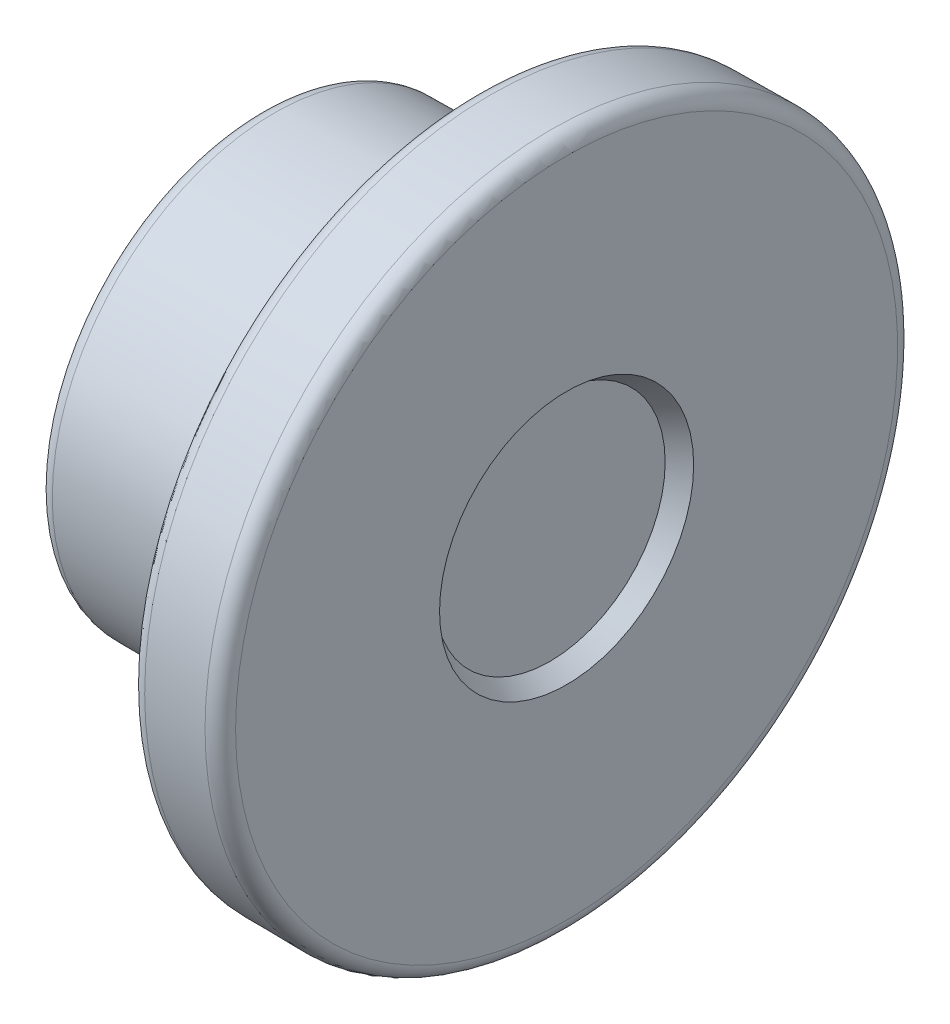
ISO-10303-21;
HEADER;
FILE_DESCRIPTION(('STEP AP214'),'2;1');
FILE_NAME('part.step','',(''),(''),'','','');
FILE_SCHEMA(('AUTOMOTIVE_DESIGN { 1 0 10303 214 1 1 1 1 }'));
ENDSEC;
DATA;
#1=APPLICATION_CONTEXT('core data for automotive mechanical design processes');
#2=APPLICATION_PROTOCOL_DEFINITION('international standard','automotive_design',2000,#1);
#3=PRODUCT_CONTEXT('',#1,'mechanical');
#4=PRODUCT('Part','Part','',(#3));
#5=PRODUCT_RELATED_PRODUCT_CATEGORY('part','',(#4));
#6=PRODUCT_DEFINITION_FORMATION('','',#4);
#7=PRODUCT_DEFINITION_CONTEXT('part definition',#1,'design');
#8=PRODUCT_DEFINITION('design','',#6,#7);
#9=PRODUCT_DEFINITION_SHAPE('','',#8);
#10=(LENGTH_UNIT() NAMED_UNIT(*) SI_UNIT(.MILLI.,.METRE.));
#11=(NAMED_UNIT(*) PLANE_ANGLE_UNIT() SI_UNIT($,.RADIAN.));
#12=(NAMED_UNIT(*) SI_UNIT($,.STERADIAN.) SOLID_ANGLE_UNIT());
#13=UNCERTAINTY_MEASURE_WITH_UNIT(LENGTH_MEASURE(1.E-05),#10,'distance_accuracy_value','');
#14=(GEOMETRIC_REPRESENTATION_CONTEXT(3) GLOBAL_UNCERTAINTY_ASSIGNED_CONTEXT((#13)) GLOBAL_UNIT_ASSIGNED_CONTEXT((#10,
#11,#12)) REPRESENTATION_CONTEXT('',''));
#15=CARTESIAN_POINT('',(0.,0.,0.));
#16=DIRECTION('',(0.,0.,1.));
#17=DIRECTION('',(1.,0.,0.));
#18=AXIS2_PLACEMENT_3D('',#15,#16,#17);
#19=CARTESIAN_POINT('',(10.3187457474607,25.8680369153271,42.0160979008728));
#20=DIRECTION('',(1.,0.,0.));
#21=DIRECTION('',(0.,0.,1.));
#22=AXIS2_PLACEMENT_3D('',#19,#20,#21);
#23=CONICAL_SURFACE('',#22,3.65000000000005,0.00872664625997167);
#24=CARTESIAN_POINT('',(10.2665641135861,25.8680369153271,42.0160979008728));
#25=DIRECTION('',(-1.,0.,0.));
#26=DIRECTION('',(0.,0.,1.));
#27=AXIS2_PLACEMENT_3D('',#24,#25,#26);
#28=CIRCLE('',#27,3.64954461778012);
#29=CARTESIAN_POINT('',(10.2665641135861,25.8680369153271,45.6656425186529));
#30=VERTEX_POINT('',#29);
#31=EDGE_CURVE('E53',#30,#30,#28,.F.);
#32=ORIENTED_EDGE('',*,*,#31,.T.);
#33=EDGE_LOOP('',(#32));
#34=FACE_BOUND('',#33,.T.);
#35=CARTESIAN_POINT('',(13.3209273813353,25.8680369153271,42.0160979008728));
#36=DIRECTION('',(-1.,0.,0.));
#37=DIRECTION('',(0.,0.,1.));
#38=AXIS2_PLACEMENT_3D('',#35,#36,#37);
#39=CIRCLE('',#38,3.67619964220272);
#40=CARTESIAN_POINT('',(13.3209273813353,25.8680369153271,45.6922975430755));
#41=VERTEX_POINT('',#40);
#42=EDGE_CURVE('E57',#41,#41,#39,.T.);
#43=ORIENTED_EDGE('',*,*,#42,.T.);
#44=EDGE_LOOP('',(#43));
#45=FACE_BOUND('',#44,.T.);
#46=ADVANCED_FACE('F42',(#34,#45),#23,.T.);
#47=CARTESIAN_POINT('',(10.0187457474607,25.8680369153271,42.0160979008728));
#48=DIRECTION('',(-1.,0.,0.));
#49=DIRECTION('',(0.,0.,1.));
#50=AXIS2_PLACEMENT_3D('',#47,#48,#49);
#51=PLANE('',#50);
#52=CARTESIAN_POINT('',(10.0187457474607,25.8680369153271,42.0160979008728));
#53=DIRECTION('',(-1.,0.,0.));
#54=DIRECTION('',(0.,0.,1.));
#55=AXIS2_PLACEMENT_3D('',#52,#53,#54);
#56=CIRCLE('',#55,3.39955413701408);
#57=CARTESIAN_POINT('',(10.0187457474607,25.8680369153271,45.4156520378869));
#58=VERTEX_POINT('',#57);
#59=EDGE_CURVE('E62',#58,#58,#56,.T.);
#60=ORIENTED_EDGE('',*,*,#59,.T.);
#61=EDGE_LOOP('',(#60));
#62=FACE_BOUND('',#61,.T.);
#63=ADVANCED_FACE('F100',(#62),#51,.T.);
#64=CARTESIAN_POINT('',(15.8187457474607,25.8680369153271,42.0160979008728));
#65=DIRECTION('',(1.,0.,0.));
#66=DIRECTION('',(0.,0.,-1.));
#67=AXIS2_PLACEMENT_3D('',#64,#65,#66);
#68=CONICAL_SURFACE('',#67,5.69799777284922,0.00872664625997167);
#69=CARTESIAN_POINT('',(14.8165641135861,25.8680369153271,42.0160979008728));
#70=DIRECTION('',(1.,0.,0.));
#71=DIRECTION('',(0.,0.,-1.));
#72=AXIS2_PLACEMENT_3D('',#69,#70,#71);
#73=CIRCLE('',#72,5.68925186622807);
#74=CARTESIAN_POINT('',(14.8165641135861,25.8680369153271,36.3268460346447));
#75=VERTEX_POINT('',#74);
#76=EDGE_CURVE('E65',#75,#75,#73,.F.);
#77=ORIENTED_EDGE('',*,*,#76,.T.);
#78=EDGE_LOOP('',(#77));
#79=FACE_BOUND('',#78,.T.);
#80=CARTESIAN_POINT('',(13.8165641135861,25.8680369153271,42.0160979008728));
#81=DIRECTION('',(1.,0.,0.));
#82=DIRECTION('',(0.,0.,-1.));
#83=AXIS2_PLACEMENT_3D('',#80,#81,#82);
#84=CIRCLE('',#83,5.68052499843732);
#85=CARTESIAN_POINT('',(13.8165641135861,25.8680369153271,36.3355729024355));
#86=VERTEX_POINT('',#85);
#87=EDGE_CURVE('E68',#86,#86,#84,.T.);
#88=ORIENTED_EDGE('',*,*,#87,.T.);
#89=EDGE_LOOP('',(#88));
#90=FACE_BOUND('',#89,.T.);
#91=ADVANCED_FACE('F106',(#79,#90),#68,.T.);
#92=CARTESIAN_POINT('',(13.5687457474607,25.8680369153271,42.0160979008728));
#93=DIRECTION('',(1.,0.,0.));
#94=DIRECTION('',(0.,0.,-1.));
#95=AXIS2_PLACEMENT_3D('',#92,#93,#94);
#96=PLANE('',#95);
#97=CARTESIAN_POINT('',(13.5687457474607,25.8680369153271,42.0160979008728));
#98=DIRECTION('',(1.,0.,0.));
#99=DIRECTION('',(0.,0.,-1.));
#100=AXIS2_PLACEMENT_3D('',#97,#98,#99);
#101=CIRCLE('',#100,3.92619012296876);
#102=CARTESIAN_POINT('',(13.5687457474607,25.8680369153271,38.089907777904));
#103=VERTEX_POINT('',#102);
#104=EDGE_CURVE('E11',#103,#103,#101,.T.);
#105=ORIENTED_EDGE('',*,*,#104,.T.);
#106=EDGE_LOOP('',(#105));
#107=FACE_BOUND('',#106,.T.);
#108=CARTESIAN_POINT('',(13.5687457474607,25.8680369153271,42.0160979008728));
#109=DIRECTION('',(1.,0.,0.));
#110=DIRECTION('',(0.,0.,-1.));
#111=AXIS2_PLACEMENT_3D('',#108,#109,#110);
#112=CIRCLE('',#111,5.43053451767127);
#113=CARTESIAN_POINT('',(13.5687457474607,25.8680369153271,36.5855633832015));
#114=VERTEX_POINT('',#113);
#115=EDGE_CURVE('E49',#114,#114,#112,.F.);
#116=ORIENTED_EDGE('',*,*,#115,.T.);
#117=EDGE_LOOP('',(#116));
#118=FACE_BOUND('',#117,.T.);
#119=ADVANCED_FACE('F95',(#107,#118),#96,.F.);
#120=CARTESIAN_POINT('',(15.0687457474607,25.8680369153271,42.0160979008728));
#121=DIRECTION('',(-1.,0.,0.));
#122=DIRECTION('',(0.,0.,1.));
#123=AXIS2_PLACEMENT_3D('',#120,#121,#122);
#124=PLANE('',#123);
#125=CARTESIAN_POINT('',(15.0687457474607,25.8680369153271,42.0160979008728));
#126=DIRECTION('',(-1.,0.,0.));
#127=DIRECTION('',(0.,0.,1.));
#128=AXIS2_PLACEMENT_3D('',#125,#126,#127);
#129=CIRCLE('',#128,5.43926138546203);
#130=CARTESIAN_POINT('',(15.0687457474607,25.8680369153271,47.4553592863348));
#131=VERTEX_POINT('',#130);
#132=EDGE_CURVE('E71',#131,#131,#129,.F.);
#133=ORIENTED_EDGE('',*,*,#132,.T.);
#134=EDGE_LOOP('',(#133));
#135=FACE_BOUND('',#134,.T.);
#136=CARTESIAN_POINT('',(15.0687457474607,25.8680369153271,42.0160979008728));
#137=DIRECTION('',(-1.,0.,0.));
#138=DIRECTION('',(0.,0.,1.));
#139=AXIS2_PLACEMENT_3D('',#136,#137,#138);
#140=CIRCLE('',#139,2.0880338913956);
#141=CARTESIAN_POINT('',(15.0687457474607,25.8680369153271,44.1041317922684));
#142=VERTEX_POINT('',#141);
#143=EDGE_CURVE('E74',#142,#142,#140,.T.);
#144=ORIENTED_EDGE('',*,*,#143,.T.);
#145=EDGE_LOOP('',(#144));
#146=FACE_BOUND('',#145,.T.);
#147=ADVANCED_FACE('F81',(#135,#146),#124,.F.);
#148=CARTESIAN_POINT('',(14.545614562859,25.8680369153271,42.0160979008728));
#149=DIRECTION('',(1.,0.,0.));
#150=DIRECTION('',(0.,1.,0.));
#151=AXIS2_PLACEMENT_3D('',#148,#149,#150);
#152=CONICAL_SURFACE('',#151,1.71436875953724,0.620249485982821);
#153=CARTESIAN_POINT('',(14.795614562859,25.8680369153271,42.0160979008728));
#154=DIRECTION('',(-1.,0.,0.));
#155=DIRECTION('',(0.,-1.,0.));
#156=AXIS2_PLACEMENT_3D('',#153,#154,#155);
#157=CIRCLE('',#156,1.89294018810867);
#158=CARTESIAN_POINT('',(14.795614562859,23.9750967272184,42.0160979008728));
#159=VERTEX_POINT('',#158);
#160=EDGE_CURVE('E75',#159,#159,#157,.T.);
#161=ORIENTED_EDGE('',*,*,#160,.T.);
#162=EDGE_LOOP('',(#161));
#163=FACE_BOUND('',#162,.T.);
#164=ORIENTED_EDGE('',*,*,#143,.F.);
#165=EDGE_LOOP('',(#164));
#166=FACE_BOUND('',#165,.T.);
#167=ADVANCED_FACE('F83',(#163,#166),#152,.F.);
#168=CARTESIAN_POINT('',(14.795614562859,27.5824056748643,42.0160979008728));
#169=DIRECTION('',(-1.,0.,0.));
#170=DIRECTION('',(0.,-1.,0.));
#171=AXIS2_PLACEMENT_3D('',#168,#169,#170);
#172=PLANE('',#171);
#173=ORIENTED_EDGE('',*,*,#160,.F.);
#174=EDGE_LOOP('',(#173));
#175=FACE_BOUND('',#174,.T.);
#176=ADVANCED_FACE('F85',(#175),#172,.F.);
#177=CARTESIAN_POINT('',(14.8187457474607,25.8680369153271,42.0160979008728));
#178=DIRECTION('',(-1.,0.,0.));
#179=DIRECTION('',(0.,0.,1.));
#180=AXIS2_PLACEMENT_3D('',#177,#178,#179);
#181=TOROIDAL_SURFACE('',#180,5.43926138546203,0.25);
#182=ORIENTED_EDGE('',*,*,#76,.F.);
#183=EDGE_LOOP('',(#182));
#184=FACE_BOUND('',#183,.T.);
#185=ORIENTED_EDGE('',*,*,#132,.F.);
#186=EDGE_LOOP('',(#185));
#187=FACE_BOUND('',#186,.T.);
#188=ADVANCED_FACE('F92',(#184,#187),#181,.T.);
#189=CARTESIAN_POINT('',(10.2687457474607,25.8680369153271,42.0160979008728));
#190=DIRECTION('',(-1.,0.,0.));
#191=DIRECTION('',(0.,0.,1.));
#192=AXIS2_PLACEMENT_3D('',#189,#190,#191);
#193=TOROIDAL_SURFACE('',#192,3.39955413701408,0.25);
#194=ORIENTED_EDGE('',*,*,#31,.F.);
#195=EDGE_LOOP('',(#194));
#196=FACE_BOUND('',#195,.T.);
#197=ORIENTED_EDGE('',*,*,#59,.F.);
#198=EDGE_LOOP('',(#197));
#199=FACE_BOUND('',#198,.T.);
#200=ADVANCED_FACE('F115',(#196,#199),#193,.T.);
#201=CARTESIAN_POINT('',(13.3187457474607,25.8680369153271,42.0160979008728));
#202=DIRECTION('',(1.,0.,0.));
#203=DIRECTION('',(0.,0.,-1.));
#204=AXIS2_PLACEMENT_3D('',#201,#202,#203);
#205=TOROIDAL_SURFACE('',#204,3.92619012296876,0.25);
#206=ORIENTED_EDGE('',*,*,#104,.F.);
#207=EDGE_LOOP('',(#206));
#208=FACE_BOUND('',#207,.T.);
#209=ORIENTED_EDGE('',*,*,#42,.F.);
#210=EDGE_LOOP('',(#209));
#211=FACE_BOUND('',#210,.T.);
#212=ADVANCED_FACE('F118',(#208,#211),#205,.F.);
#213=CARTESIAN_POINT('',(13.8187457474607,25.8680369153271,42.0160979008728));
#214=DIRECTION('',(1.,0.,0.));
#215=DIRECTION('',(0.,0.,-1.));
#216=AXIS2_PLACEMENT_3D('',#213,#214,#215);
#217=TOROIDAL_SURFACE('',#216,5.43053451767127,0.25);
#218=ORIENTED_EDGE('',*,*,#115,.F.);
#219=EDGE_LOOP('',(#218));
#220=FACE_BOUND('',#219,.T.);
#221=ORIENTED_EDGE('',*,*,#87,.F.);
#222=EDGE_LOOP('',(#221));
#223=FACE_BOUND('',#222,.T.);
#224=ADVANCED_FACE('F44',(#220,#223),#217,.T.);
#225=CLOSED_SHELL('',(#46,#63,#91,#119,#147,#167,#176,#188,#200,#212,#224));
#226=MANIFOLD_SOLID_BREP('B2',#225);
#227=ADVANCED_BREP_SHAPE_REPRESENTATION('',(#18,#226),#14);
#228=SHAPE_DEFINITION_REPRESENTATION(#9,#227);
ENDSEC;
END-ISO-10303-21;
